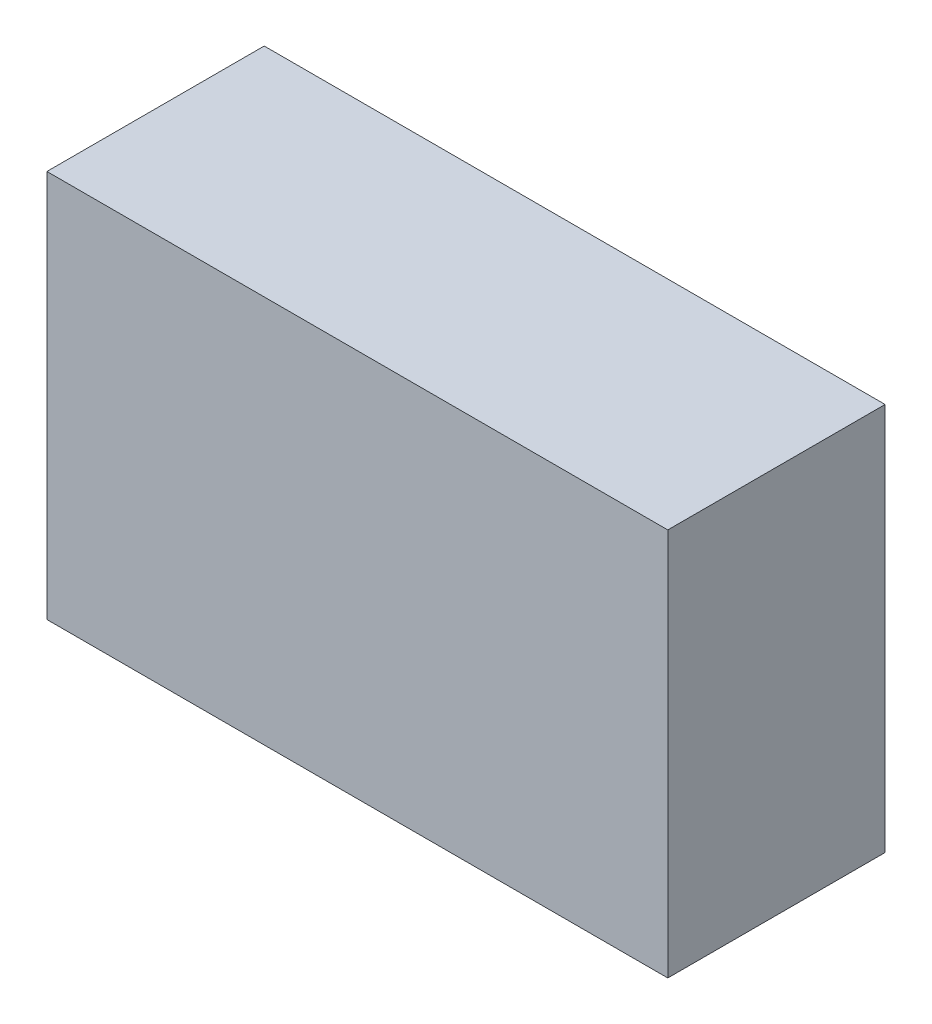
ISO-10303-21;
HEADER;
FILE_DESCRIPTION(('STEP AP214'),'2;1');
FILE_NAME('part.step','',(''),(''),'','','');
FILE_SCHEMA(('AUTOMOTIVE_DESIGN { 1 0 10303 214 1 1 1 1 }'));
ENDSEC;
DATA;
#1=APPLICATION_CONTEXT('core data for automotive mechanical design processes');
#2=APPLICATION_PROTOCOL_DEFINITION('international standard','automotive_design',2000,#1);
#3=PRODUCT_CONTEXT('',#1,'mechanical');
#4=PRODUCT('Part','Part','',(#3));
#5=PRODUCT_RELATED_PRODUCT_CATEGORY('part','',(#4));
#6=PRODUCT_DEFINITION_FORMATION('','',#4);
#7=PRODUCT_DEFINITION_CONTEXT('part definition',#1,'design');
#8=PRODUCT_DEFINITION('design','',#6,#7);
#9=PRODUCT_DEFINITION_SHAPE('','',#8);
#10=(LENGTH_UNIT() NAMED_UNIT(*) SI_UNIT(.MILLI.,.METRE.));
#11=(NAMED_UNIT(*) PLANE_ANGLE_UNIT() SI_UNIT($,.RADIAN.));
#12=(NAMED_UNIT(*) SI_UNIT($,.STERADIAN.) SOLID_ANGLE_UNIT());
#13=UNCERTAINTY_MEASURE_WITH_UNIT(LENGTH_MEASURE(1.E-05),#10,'distance_accuracy_value','');
#14=(GEOMETRIC_REPRESENTATION_CONTEXT(3) GLOBAL_UNCERTAINTY_ASSIGNED_CONTEXT((#13)) GLOBAL_UNIT_ASSIGNED_CONTEXT((#10,
#11,#12)) REPRESENTATION_CONTEXT('',''));
#15=CARTESIAN_POINT('',(0.,0.,0.));
#16=DIRECTION('',(0.,0.,1.));
#17=DIRECTION('',(1.,0.,0.));
#18=AXIS2_PLACEMENT_3D('',#15,#16,#17);
#19=CARTESIAN_POINT('',(1.00000054,-0.62500002,0.70000114));
#20=DIRECTION('',(0.,0.,-1.));
#21=DIRECTION('',(-1.,0.,0.));
#22=AXIS2_PLACEMENT_3D('',#19,#20,#21);
#23=PLANE('',#22);
#24=DIRECTION('',(1.,0.,0.));
#25=VECTOR('',#24,1.);
#26=CARTESIAN_POINT('',(1.00000054,0.62500002,0.70000114));
#27=LINE('',#26,#25);
#28=CARTESIAN_POINT('',(1.00000054,0.62500002,0.70000114));
#29=VERTEX_POINT('',#28);
#30=CARTESIAN_POINT('',(-1.00000054,0.62500002,0.70000114));
#31=VERTEX_POINT('',#30);
#32=EDGE_CURVE('E79',#29,#31,#27,.F.);
#33=ORIENTED_EDGE('',*,*,#32,.T.);
#34=DIRECTION('',(0.,1.,0.));
#35=VECTOR('',#34,1.);
#36=CARTESIAN_POINT('',(-1.00000054,0.62500002,0.70000114));
#37=LINE('',#36,#35);
#38=CARTESIAN_POINT('',(-1.00000054,-0.62500002,0.70000114));
#39=VERTEX_POINT('',#38);
#40=EDGE_CURVE('E55',#31,#39,#37,.F.);
#41=ORIENTED_EDGE('',*,*,#40,.T.);
#42=DIRECTION('',(1.,0.,0.));
#43=VECTOR('',#42,1.);
#44=CARTESIAN_POINT('',(-1.00000054,-0.62500002,0.70000114));
#45=LINE('',#44,#43);
#46=CARTESIAN_POINT('',(1.00000054,-0.62500002,0.70000114));
#47=VERTEX_POINT('',#46);
#48=EDGE_CURVE('E57',#39,#47,#45,.T.);
#49=ORIENTED_EDGE('',*,*,#48,.T.);
#50=DIRECTION('',(0.,1.,0.));
#51=VECTOR('',#50,1.);
#52=CARTESIAN_POINT('',(1.00000054,-0.62500002,0.70000114));
#53=LINE('',#52,#51);
#54=EDGE_CURVE('E20',#47,#29,#53,.T.);
#55=ORIENTED_EDGE('',*,*,#54,.T.);
#56=EDGE_LOOP('',(#33,#41,#49,#55));
#57=FACE_BOUND('',#56,.T.);
#58=ADVANCED_FACE('F17',(#57),#23,.F.);
#59=CARTESIAN_POINT('',(1.00000054,-0.62500002,0.));
#60=DIRECTION('',(-1.,0.,0.));
#61=DIRECTION('',(0.,0.,1.));
#62=AXIS2_PLACEMENT_3D('',#59,#60,#61);
#63=PLANE('',#62);
#64=DIRECTION('',(0.,1.,0.));
#65=VECTOR('',#64,1.);
#66=CARTESIAN_POINT('',(1.00000054,-0.62500002,0.));
#67=LINE('',#66,#65);
#68=CARTESIAN_POINT('',(1.00000054,0.62500002,0.));
#69=VERTEX_POINT('',#68);
#70=CARTESIAN_POINT('',(1.00000054,-0.62500002,0.));
#71=VERTEX_POINT('',#70);
#72=EDGE_CURVE('E83',#69,#71,#67,.F.);
#73=ORIENTED_EDGE('',*,*,#72,.F.);
#74=DIRECTION('',(0.,0.,-1.));
#75=VECTOR('',#74,1.);
#76=CARTESIAN_POINT('',(1.00000054,0.62500002,0.));
#77=LINE('',#76,#75);
#78=EDGE_CURVE('E68',#69,#29,#77,.F.);
#79=ORIENTED_EDGE('',*,*,#78,.T.);
#80=ORIENTED_EDGE('',*,*,#54,.F.);
#81=DIRECTION('',(0.,0.,1.));
#82=VECTOR('',#81,1.);
#83=CARTESIAN_POINT('',(1.00000054,-0.62500002,0.));
#84=LINE('',#83,#82);
#85=EDGE_CURVE('E63',#47,#71,#84,.F.);
#86=ORIENTED_EDGE('',*,*,#85,.T.);
#87=EDGE_LOOP('',(#73,#79,#80,#86));
#88=FACE_BOUND('',#87,.T.);
#89=ADVANCED_FACE('F65',(#88),#63,.F.);
#90=CARTESIAN_POINT('',(-1.00000054,-0.62500002,0.));
#91=DIRECTION('',(0.,1.,0.));
#92=DIRECTION('',(0.,0.,1.));
#93=AXIS2_PLACEMENT_3D('',#90,#91,#92);
#94=PLANE('',#93);
#95=DIRECTION('',(-1.,0.,0.));
#96=VECTOR('',#95,1.);
#97=CARTESIAN_POINT('',(1.00000054,-0.62500002,0.));
#98=LINE('',#97,#96);
#99=CARTESIAN_POINT('',(-1.00000054,-0.62500002,0.));
#100=VERTEX_POINT('',#99);
#101=EDGE_CURVE('E72',#71,#100,#98,.T.);
#102=ORIENTED_EDGE('',*,*,#101,.F.);
#103=ORIENTED_EDGE('',*,*,#85,.F.);
#104=ORIENTED_EDGE('',*,*,#48,.F.);
#105=DIRECTION('',(0.,0.,-1.));
#106=VECTOR('',#105,1.);
#107=CARTESIAN_POINT('',(-1.00000054,-0.62500002,0.));
#108=LINE('',#107,#106);
#109=EDGE_CURVE('E75',#39,#100,#108,.T.);
#110=ORIENTED_EDGE('',*,*,#109,.T.);
#111=EDGE_LOOP('',(#102,#103,#104,#110));
#112=FACE_BOUND('',#111,.T.);
#113=ADVANCED_FACE('F70',(#112),#94,.F.);
#114=CARTESIAN_POINT('',(-1.00000054,0.62500002,0.));
#115=DIRECTION('',(1.,0.,0.));
#116=DIRECTION('',(0.,0.,-1.));
#117=AXIS2_PLACEMENT_3D('',#114,#115,#116);
#118=PLANE('',#117);
#119=DIRECTION('',(0.,1.,0.));
#120=VECTOR('',#119,1.);
#121=CARTESIAN_POINT('',(-1.00000054,-0.62500002,0.));
#122=LINE('',#121,#120);
#123=CARTESIAN_POINT('',(-1.00000054,0.62500002,0.));
#124=VERTEX_POINT('',#123);
#125=EDGE_CURVE('E26',#100,#124,#122,.T.);
#126=ORIENTED_EDGE('',*,*,#125,.F.);
#127=ORIENTED_EDGE('',*,*,#109,.F.);
#128=ORIENTED_EDGE('',*,*,#40,.F.);
#129=DIRECTION('',(0.,0.,-1.));
#130=VECTOR('',#129,1.);
#131=CARTESIAN_POINT('',(-1.00000054,0.62500002,0.));
#132=LINE('',#131,#130);
#133=EDGE_CURVE('E35',#31,#124,#132,.T.);
#134=ORIENTED_EDGE('',*,*,#133,.T.);
#135=EDGE_LOOP('',(#126,#127,#128,#134));
#136=FACE_BOUND('',#135,.T.);
#137=ADVANCED_FACE('F89',(#136),#118,.F.);
#138=CARTESIAN_POINT('',(1.00000054,0.62500002,0.));
#139=DIRECTION('',(0.,-1.,0.));
#140=DIRECTION('',(0.,0.,-1.));
#141=AXIS2_PLACEMENT_3D('',#138,#139,#140);
#142=PLANE('',#141);
#143=DIRECTION('',(-1.,0.,0.));
#144=VECTOR('',#143,1.);
#145=CARTESIAN_POINT('',(1.00000054,0.62500002,0.));
#146=LINE('',#145,#144);
#147=EDGE_CURVE('E11',#124,#69,#146,.F.);
#148=ORIENTED_EDGE('',*,*,#147,.F.);
#149=ORIENTED_EDGE('',*,*,#133,.F.);
#150=ORIENTED_EDGE('',*,*,#32,.F.);
#151=ORIENTED_EDGE('',*,*,#78,.F.);
#152=EDGE_LOOP('',(#148,#149,#150,#151));
#153=FACE_BOUND('',#152,.T.);
#154=ADVANCED_FACE('F91',(#153),#142,.F.);
#155=CARTESIAN_POINT('',(1.00000054,-0.62500002,0.));
#156=DIRECTION('',(0.,0.,-1.));
#157=DIRECTION('',(-1.,0.,0.));
#158=AXIS2_PLACEMENT_3D('',#155,#156,#157);
#159=PLANE('',#158);
#160=ORIENTED_EDGE('',*,*,#125,.T.);
#161=ORIENTED_EDGE('',*,*,#147,.T.);
#162=ORIENTED_EDGE('',*,*,#72,.T.);
#163=ORIENTED_EDGE('',*,*,#101,.T.);
#164=EDGE_LOOP('',(#160,#161,#162,#163));
#165=FACE_BOUND('',#164,.T.);
#166=ADVANCED_FACE('F88',(#165),#159,.T.);
#167=CLOSED_SHELL('',(#58,#89,#113,#137,#154,#166));
#168=MANIFOLD_SOLID_BREP('B1',#167);
#169=ADVANCED_BREP_SHAPE_REPRESENTATION('',(#18,#168),#14);
#170=SHAPE_DEFINITION_REPRESENTATION(#9,#169);
ENDSEC;
END-ISO-10303-21;
